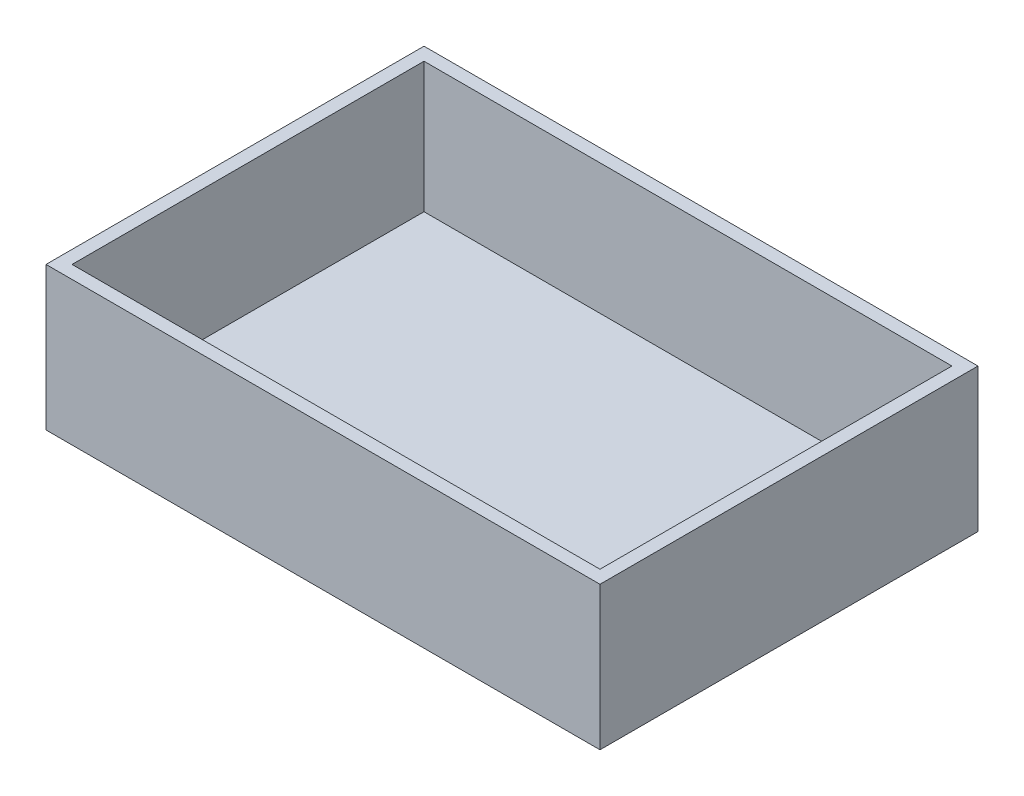
ISO-10303-21;
HEADER;
FILE_DESCRIPTION(('STEP AP214'),'2;1');
FILE_NAME('part.step','',(''),(''),'','','');
FILE_SCHEMA(('AUTOMOTIVE_DESIGN { 1 0 10303 214 1 1 1 1 }'));
ENDSEC;
DATA;
#1=APPLICATION_CONTEXT('core data for automotive mechanical design processes');
#2=APPLICATION_PROTOCOL_DEFINITION('international standard','automotive_design',2000,#1);
#3=PRODUCT_CONTEXT('',#1,'mechanical');
#4=PRODUCT('Part','Part','',(#3));
#5=PRODUCT_RELATED_PRODUCT_CATEGORY('part','',(#4));
#6=PRODUCT_DEFINITION_FORMATION('','',#4);
#7=PRODUCT_DEFINITION_CONTEXT('part definition',#1,'design');
#8=PRODUCT_DEFINITION('design','',#6,#7);
#9=PRODUCT_DEFINITION_SHAPE('','',#8);
#10=(LENGTH_UNIT() NAMED_UNIT(*) SI_UNIT(.MILLI.,.METRE.));
#11=(NAMED_UNIT(*) PLANE_ANGLE_UNIT() SI_UNIT($,.RADIAN.));
#12=(NAMED_UNIT(*) SI_UNIT($,.STERADIAN.) SOLID_ANGLE_UNIT());
#13=UNCERTAINTY_MEASURE_WITH_UNIT(LENGTH_MEASURE(1.E-05),#10,'distance_accuracy_value','');
#14=(GEOMETRIC_REPRESENTATION_CONTEXT(3) GLOBAL_UNCERTAINTY_ASSIGNED_CONTEXT((#13)) GLOBAL_UNIT_ASSIGNED_CONTEXT((#10,
#11,#12)) REPRESENTATION_CONTEXT('',''));
#15=CARTESIAN_POINT('',(0.,0.,0.));
#16=DIRECTION('',(0.,0.,1.));
#17=DIRECTION('',(1.,0.,0.));
#18=AXIS2_PLACEMENT_3D('',#15,#16,#17);
#19=CARTESIAN_POINT('',(0.,100.,0.));
#20=DIRECTION('',(0.,1.,0.));
#21=DIRECTION('',(0.,0.,1.));
#22=AXIS2_PLACEMENT_3D('',#19,#20,#21);
#23=PLANE('',#22);
#24=DIRECTION('',(0.,0.,1.));
#25=VECTOR('',#24,1.);
#26=CARTESIAN_POINT('',(-212.5,100.,-145.));
#27=LINE('',#26,#25);
#28=CARTESIAN_POINT('',(-212.5,100.,-145.));
#29=VERTEX_POINT('',#28);
#30=CARTESIAN_POINT('',(-212.5,100.,145.));
#31=VERTEX_POINT('',#30);
#32=EDGE_CURVE('E150',#29,#31,#27,.T.);
#33=ORIENTED_EDGE('',*,*,#32,.T.);
#34=DIRECTION('',(1.,0.,0.));
#35=VECTOR('',#34,1.);
#36=CARTESIAN_POINT('',(-212.5,100.,145.));
#37=LINE('',#36,#35);
#38=CARTESIAN_POINT('',(212.5,100.,145.));
#39=VERTEX_POINT('',#38);
#40=EDGE_CURVE('E103',#31,#39,#37,.T.);
#41=ORIENTED_EDGE('',*,*,#40,.T.);
#42=DIRECTION('',(0.,0.,-1.));
#43=VECTOR('',#42,1.);
#44=CARTESIAN_POINT('',(212.5,100.,-145.));
#45=LINE('',#44,#43);
#46=CARTESIAN_POINT('',(212.5,100.,-145.));
#47=VERTEX_POINT('',#46);
#48=EDGE_CURVE('E153',#39,#47,#45,.T.);
#49=ORIENTED_EDGE('',*,*,#48,.T.);
#50=DIRECTION('',(-1.,0.,0.));
#51=VECTOR('',#50,1.);
#52=CARTESIAN_POINT('',(-212.5,100.,-145.));
#53=LINE('',#52,#51);
#54=EDGE_CURVE('E56',#47,#29,#53,.T.);
#55=ORIENTED_EDGE('',*,*,#54,.T.);
#56=EDGE_LOOP('',(#33,#41,#49,#55));
#57=FACE_BOUND('',#56,.T.);
#58=DIRECTION('',(-1.,0.,0.));
#59=VECTOR('',#58,1.);
#60=CARTESIAN_POINT('',(-202.5,100.,-135.));
#61=LINE('',#60,#59);
#62=CARTESIAN_POINT('',(202.5,100.,-135.));
#63=VERTEX_POINT('',#62);
#64=CARTESIAN_POINT('',(-202.5,100.,-135.));
#65=VERTEX_POINT('',#64);
#66=EDGE_CURVE('E125',#63,#65,#61,.T.);
#67=ORIENTED_EDGE('',*,*,#66,.F.);
#68=DIRECTION('',(0.,0.,-1.));
#69=VECTOR('',#68,1.);
#70=CARTESIAN_POINT('',(202.5,100.,-135.));
#71=LINE('',#70,#69);
#72=CARTESIAN_POINT('',(202.5,100.,135.));
#73=VERTEX_POINT('',#72);
#74=EDGE_CURVE('E123',#73,#63,#71,.T.);
#75=ORIENTED_EDGE('',*,*,#74,.F.);
#76=DIRECTION('',(1.,0.,0.));
#77=VECTOR('',#76,1.);
#78=CARTESIAN_POINT('',(-202.5,100.,135.));
#79=LINE('',#78,#77);
#80=CARTESIAN_POINT('',(-202.5,100.,135.));
#81=VERTEX_POINT('',#80);
#82=EDGE_CURVE('E130',#81,#73,#79,.T.);
#83=ORIENTED_EDGE('',*,*,#82,.F.);
#84=DIRECTION('',(0.,0.,1.));
#85=VECTOR('',#84,1.);
#86=CARTESIAN_POINT('',(-202.5,100.,-135.));
#87=LINE('',#86,#85);
#88=EDGE_CURVE('E128',#65,#81,#87,.T.);
#89=ORIENTED_EDGE('',*,*,#88,.F.);
#90=EDGE_LOOP('',(#67,#75,#83,#89));
#91=FACE_BOUND('',#90,.T.);
#92=ADVANCED_FACE('F33',(#57,#91),#23,.T.);
#93=CARTESIAN_POINT('',(-212.5,100.,-145.));
#94=DIRECTION('',(1.,0.,0.));
#95=DIRECTION('',(0.,0.,-1.));
#96=AXIS2_PLACEMENT_3D('',#93,#94,#95);
#97=PLANE('',#96);
#98=DIRECTION('',(0.,-1.,0.));
#99=VECTOR('',#98,1.);
#100=CARTESIAN_POINT('',(-212.5,100.,-145.));
#101=LINE('',#100,#99);
#102=CARTESIAN_POINT('',(-212.5,-10.,-145.));
#103=VERTEX_POINT('',#102);
#104=EDGE_CURVE('E108',#29,#103,#101,.T.);
#105=ORIENTED_EDGE('',*,*,#104,.T.);
#106=DIRECTION('',(0.,0.,-1.));
#107=VECTOR('',#106,1.);
#108=CARTESIAN_POINT('',(-212.5,-10.,145.));
#109=LINE('',#108,#107);
#110=CARTESIAN_POINT('',(-212.5,-10.,145.));
#111=VERTEX_POINT('',#110);
#112=EDGE_CURVE('E107',#111,#103,#109,.T.);
#113=ORIENTED_EDGE('',*,*,#112,.F.);
#114=DIRECTION('',(0.,-1.,0.));
#115=VECTOR('',#114,1.);
#116=CARTESIAN_POINT('',(-212.5,100.,145.));
#117=LINE('',#116,#115);
#118=EDGE_CURVE('E11',#31,#111,#117,.T.);
#119=ORIENTED_EDGE('',*,*,#118,.F.);
#120=ORIENTED_EDGE('',*,*,#32,.F.);
#121=EDGE_LOOP('',(#105,#113,#119,#120));
#122=FACE_BOUND('',#121,.T.);
#123=ADVANCED_FACE('F35',(#122),#97,.F.);
#124=CARTESIAN_POINT('',(-212.5,100.,145.));
#125=DIRECTION('',(0.,0.,-1.));
#126=DIRECTION('',(-1.,0.,0.));
#127=AXIS2_PLACEMENT_3D('',#124,#125,#126);
#128=PLANE('',#127);
#129=ORIENTED_EDGE('',*,*,#118,.T.);
#130=DIRECTION('',(-1.,0.,0.));
#131=VECTOR('',#130,1.);
#132=CARTESIAN_POINT('',(212.5,-10.,145.));
#133=LINE('',#132,#131);
#134=CARTESIAN_POINT('',(212.5,-10.,145.));
#135=VERTEX_POINT('',#134);
#136=EDGE_CURVE('E102',#135,#111,#133,.T.);
#137=ORIENTED_EDGE('',*,*,#136,.F.);
#138=DIRECTION('',(0.,-1.,0.));
#139=VECTOR('',#138,1.);
#140=CARTESIAN_POINT('',(212.5,100.,145.));
#141=LINE('',#140,#139);
#142=EDGE_CURVE('E41',#39,#135,#141,.T.);
#143=ORIENTED_EDGE('',*,*,#142,.F.);
#144=ORIENTED_EDGE('',*,*,#40,.F.);
#145=EDGE_LOOP('',(#129,#137,#143,#144));
#146=FACE_BOUND('',#145,.T.);
#147=ADVANCED_FACE('F99',(#146),#128,.F.);
#148=CARTESIAN_POINT('',(212.5,100.,-145.));
#149=DIRECTION('',(-1.,0.,0.));
#150=DIRECTION('',(0.,0.,1.));
#151=AXIS2_PLACEMENT_3D('',#148,#149,#150);
#152=PLANE('',#151);
#153=ORIENTED_EDGE('',*,*,#142,.T.);
#154=DIRECTION('',(0.,0.,1.));
#155=VECTOR('',#154,1.);
#156=CARTESIAN_POINT('',(212.5,-10.,-145.));
#157=LINE('',#156,#155);
#158=CARTESIAN_POINT('',(212.5,-10.,-145.));
#159=VERTEX_POINT('',#158);
#160=EDGE_CURVE('E117',#159,#135,#157,.T.);
#161=ORIENTED_EDGE('',*,*,#160,.F.);
#162=DIRECTION('',(0.,-1.,0.));
#163=VECTOR('',#162,1.);
#164=CARTESIAN_POINT('',(212.5,100.,-145.));
#165=LINE('',#164,#163);
#166=EDGE_CURVE('E157',#47,#159,#165,.T.);
#167=ORIENTED_EDGE('',*,*,#166,.F.);
#168=ORIENTED_EDGE('',*,*,#48,.F.);
#169=EDGE_LOOP('',(#153,#161,#167,#168));
#170=FACE_BOUND('',#169,.T.);
#171=ADVANCED_FACE('F160',(#170),#152,.F.);
#172=CARTESIAN_POINT('',(-212.5,100.,-145.));
#173=DIRECTION('',(0.,0.,1.));
#174=DIRECTION('',(1.,0.,0.));
#175=AXIS2_PLACEMENT_3D('',#172,#173,#174);
#176=PLANE('',#175);
#177=ORIENTED_EDGE('',*,*,#166,.T.);
#178=DIRECTION('',(1.,0.,0.));
#179=VECTOR('',#178,1.);
#180=CARTESIAN_POINT('',(-212.5,-10.,-145.));
#181=LINE('',#180,#179);
#182=EDGE_CURVE('E112',#103,#159,#181,.T.);
#183=ORIENTED_EDGE('',*,*,#182,.F.);
#184=ORIENTED_EDGE('',*,*,#104,.F.);
#185=ORIENTED_EDGE('',*,*,#54,.F.);
#186=EDGE_LOOP('',(#177,#183,#184,#185));
#187=FACE_BOUND('',#186,.T.);
#188=ADVANCED_FACE('F196',(#187),#176,.F.);
#189=CARTESIAN_POINT('',(202.5,100.,-135.));
#190=DIRECTION('',(-1.,0.,0.));
#191=DIRECTION('',(0.,0.,1.));
#192=AXIS2_PLACEMENT_3D('',#189,#190,#191);
#193=PLANE('',#192);
#194=DIRECTION('',(0.,0.,-1.));
#195=VECTOR('',#194,1.);
#196=CARTESIAN_POINT('',(202.5,0.,-135.));
#197=LINE('',#196,#195);
#198=CARTESIAN_POINT('',(202.5,0.,135.));
#199=VERTEX_POINT('',#198);
#200=CARTESIAN_POINT('',(202.5,0.,-135.));
#201=VERTEX_POINT('',#200);
#202=EDGE_CURVE('E122',#199,#201,#197,.T.);
#203=ORIENTED_EDGE('',*,*,#202,.F.);
#204=DIRECTION('',(0.,-1.,0.));
#205=VECTOR('',#204,1.);
#206=CARTESIAN_POINT('',(202.5,100.,135.));
#207=LINE('',#206,#205);
#208=EDGE_CURVE('E132',#73,#199,#207,.T.);
#209=ORIENTED_EDGE('',*,*,#208,.F.);
#210=ORIENTED_EDGE('',*,*,#74,.T.);
#211=DIRECTION('',(0.,-1.,0.));
#212=VECTOR('',#211,1.);
#213=CARTESIAN_POINT('',(202.5,100.,-135.));
#214=LINE('',#213,#212);
#215=EDGE_CURVE('E147',#63,#201,#214,.T.);
#216=ORIENTED_EDGE('',*,*,#215,.T.);
#217=EDGE_LOOP('',(#203,#209,#210,#216));
#218=FACE_BOUND('',#217,.T.);
#219=ADVANCED_FACE('F180',(#218),#193,.T.);
#220=CARTESIAN_POINT('',(-202.5,100.,-135.));
#221=DIRECTION('',(0.,0.,1.));
#222=DIRECTION('',(1.,0.,0.));
#223=AXIS2_PLACEMENT_3D('',#220,#221,#222);
#224=PLANE('',#223);
#225=DIRECTION('',(-1.,0.,0.));
#226=VECTOR('',#225,1.);
#227=CARTESIAN_POINT('',(-202.5,0.,-135.));
#228=LINE('',#227,#226);
#229=CARTESIAN_POINT('',(-202.5,0.,-135.));
#230=VERTEX_POINT('',#229);
#231=EDGE_CURVE('E135',#201,#230,#228,.T.);
#232=ORIENTED_EDGE('',*,*,#231,.F.);
#233=ORIENTED_EDGE('',*,*,#215,.F.);
#234=ORIENTED_EDGE('',*,*,#66,.T.);
#235=DIRECTION('',(0.,-1.,0.));
#236=VECTOR('',#235,1.);
#237=CARTESIAN_POINT('',(-202.5,100.,-135.));
#238=LINE('',#237,#236);
#239=EDGE_CURVE('E145',#65,#230,#238,.T.);
#240=ORIENTED_EDGE('',*,*,#239,.T.);
#241=EDGE_LOOP('',(#232,#233,#234,#240));
#242=FACE_BOUND('',#241,.T.);
#243=ADVANCED_FACE('F172',(#242),#224,.T.);
#244=CARTESIAN_POINT('',(-202.5,100.,-135.));
#245=DIRECTION('',(1.,0.,0.));
#246=DIRECTION('',(0.,0.,-1.));
#247=AXIS2_PLACEMENT_3D('',#244,#245,#246);
#248=PLANE('',#247);
#249=DIRECTION('',(0.,0.,1.));
#250=VECTOR('',#249,1.);
#251=CARTESIAN_POINT('',(-202.5,0.,-135.));
#252=LINE('',#251,#250);
#253=CARTESIAN_POINT('',(-202.5,0.,135.));
#254=VERTEX_POINT('',#253);
#255=EDGE_CURVE('E138',#230,#254,#252,.T.);
#256=ORIENTED_EDGE('',*,*,#255,.F.);
#257=ORIENTED_EDGE('',*,*,#239,.F.);
#258=ORIENTED_EDGE('',*,*,#88,.T.);
#259=DIRECTION('',(0.,-1.,0.));
#260=VECTOR('',#259,1.);
#261=CARTESIAN_POINT('',(-202.5,100.,135.));
#262=LINE('',#261,#260);
#263=EDGE_CURVE('E48',#81,#254,#262,.T.);
#264=ORIENTED_EDGE('',*,*,#263,.T.);
#265=EDGE_LOOP('',(#256,#257,#258,#264));
#266=FACE_BOUND('',#265,.T.);
#267=ADVANCED_FACE('F175',(#266),#248,.T.);
#268=CARTESIAN_POINT('',(-202.5,100.,135.));
#269=DIRECTION('',(0.,0.,-1.));
#270=DIRECTION('',(-1.,0.,0.));
#271=AXIS2_PLACEMENT_3D('',#268,#269,#270);
#272=PLANE('',#271);
#273=DIRECTION('',(1.,0.,0.));
#274=VECTOR('',#273,1.);
#275=CARTESIAN_POINT('',(-202.5,0.,135.));
#276=LINE('',#275,#274);
#277=EDGE_CURVE('E126',#254,#199,#276,.T.);
#278=ORIENTED_EDGE('',*,*,#277,.F.);
#279=ORIENTED_EDGE('',*,*,#263,.F.);
#280=ORIENTED_EDGE('',*,*,#82,.T.);
#281=ORIENTED_EDGE('',*,*,#208,.T.);
#282=EDGE_LOOP('',(#278,#279,#280,#281));
#283=FACE_BOUND('',#282,.T.);
#284=ADVANCED_FACE('F182',(#283),#272,.T.);
#285=CARTESIAN_POINT('',(0.,0.,0.));
#286=DIRECTION('',(0.,-1.,0.));
#287=DIRECTION('',(0.,0.,-1.));
#288=AXIS2_PLACEMENT_3D('',#285,#286,#287);
#289=PLANE('',#288);
#290=ORIENTED_EDGE('',*,*,#202,.T.);
#291=ORIENTED_EDGE('',*,*,#231,.T.);
#292=ORIENTED_EDGE('',*,*,#255,.T.);
#293=ORIENTED_EDGE('',*,*,#277,.T.);
#294=EDGE_LOOP('',(#290,#291,#292,#293));
#295=FACE_BOUND('',#294,.T.);
#296=ADVANCED_FACE('F177',(#295),#289,.F.);
#297=CARTESIAN_POINT('',(0.,-10.,0.));
#298=DIRECTION('',(0.,-1.,0.));
#299=DIRECTION('',(0.,0.,-1.));
#300=AXIS2_PLACEMENT_3D('',#297,#298,#299);
#301=PLANE('',#300);
#302=ORIENTED_EDGE('',*,*,#136,.T.);
#303=ORIENTED_EDGE('',*,*,#112,.T.);
#304=ORIENTED_EDGE('',*,*,#182,.T.);
#305=ORIENTED_EDGE('',*,*,#160,.T.);
#306=EDGE_LOOP('',(#302,#303,#304,#305));
#307=FACE_BOUND('',#306,.T.);
#308=ADVANCED_FACE('F115',(#307),#301,.T.);
#309=CLOSED_SHELL('',(#92,#123,#147,#171,#188,#219,#243,#267,#284,#296,#308));
#310=MANIFOLD_SOLID_BREP('B2',#309);
#311=ADVANCED_BREP_SHAPE_REPRESENTATION('',(#18,#310),#14);
#312=SHAPE_DEFINITION_REPRESENTATION(#9,#311);
ENDSEC;
END-ISO-10303-21;
